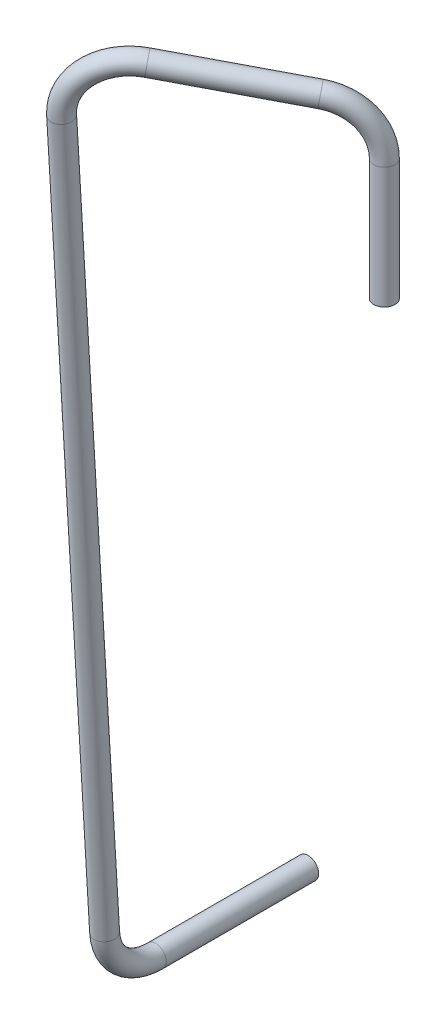
ISO-10303-21;
HEADER;
FILE_DESCRIPTION(('STEP AP214'),'2;1');
FILE_NAME('part.step','',(''),(''),'','','');
FILE_SCHEMA(('AUTOMOTIVE_DESIGN { 1 0 10303 214 1 1 1 1 }'));
ENDSEC;
DATA;
#1=APPLICATION_CONTEXT('core data for automotive mechanical design processes');
#2=APPLICATION_PROTOCOL_DEFINITION('international standard','automotive_design',2000,#1);
#3=PRODUCT_CONTEXT('',#1,'mechanical');
#4=PRODUCT('Part','Part','',(#3));
#5=PRODUCT_RELATED_PRODUCT_CATEGORY('part','',(#4));
#6=PRODUCT_DEFINITION_FORMATION('','',#4);
#7=PRODUCT_DEFINITION_CONTEXT('part definition',#1,'design');
#8=PRODUCT_DEFINITION('design','',#6,#7);
#9=PRODUCT_DEFINITION_SHAPE('','',#8);
#10=(LENGTH_UNIT() NAMED_UNIT(*) SI_UNIT(.MILLI.,.METRE.));
#11=(NAMED_UNIT(*) PLANE_ANGLE_UNIT() SI_UNIT($,.RADIAN.));
#12=(NAMED_UNIT(*) SI_UNIT($,.STERADIAN.) SOLID_ANGLE_UNIT());
#13=UNCERTAINTY_MEASURE_WITH_UNIT(LENGTH_MEASURE(1.E-05),#10,'distance_accuracy_value','');
#14=(GEOMETRIC_REPRESENTATION_CONTEXT(3) GLOBAL_UNCERTAINTY_ASSIGNED_CONTEXT((#13)) GLOBAL_UNIT_ASSIGNED_CONTEXT((#10,
#11,#12)) REPRESENTATION_CONTEXT('',''));
#15=CARTESIAN_POINT('',(0.,0.,0.));
#16=DIRECTION('',(0.,0.,1.));
#17=DIRECTION('',(1.,0.,0.));
#18=AXIS2_PLACEMENT_3D('',#15,#16,#17);
#19=CARTESIAN_POINT('',(0.,0.,0.));
#20=DIRECTION('',(0.,-1.,0.));
#21=DIRECTION('',(-0.353031889973649,0.,0.935611289297876));
#22=AXIS2_PLACEMENT_3D('',#19,#20,#21);
#23=PLANE('',#22);
#24=CARTESIAN_POINT('',(0.,0.,0.));
#25=DIRECTION('',(0.,-1.,0.));
#26=DIRECTION('',(0.,0.,-1.));
#27=AXIS2_PLACEMENT_3D('',#24,#25,#26);
#28=CIRCLE('',#27,0.585);
#29=CARTESIAN_POINT('',(0.,0.,-0.584999999999986));
#30=VERTEX_POINT('',#29);
#31=EDGE_CURVE('E78',#30,#30,#28,.T.);
#32=ORIENTED_EDGE('',*,*,#31,.F.);
#33=EDGE_LOOP('',(#32));
#34=FACE_BOUND('',#33,.T.);
#35=CARTESIAN_POINT('',(0.,0.,0.));
#36=DIRECTION('',(0.,-1.,0.));
#37=DIRECTION('',(-0.353031889973649,0.,0.935611289297876));
#38=AXIS2_PLACEMENT_3D('',#35,#36,#37);
#39=CIRCLE('',#38,1.585);
#40=CARTESIAN_POINT('',(-0.559555545608234,0.,1.48294389353715));
#41=VERTEX_POINT('',#40);
#42=EDGE_CURVE('E71',#41,#41,#39,.T.);
#43=ORIENTED_EDGE('',*,*,#42,.T.);
#44=EDGE_LOOP('',(#43));
#45=FACE_BOUND('',#44,.T.);
#46=ADVANCED_FACE('F43',(#34,#45),#23,.T.);
#47=CARTESIAN_POINT('',(-32.6331558464226,-100.644863340219,-21.2228280842737));
#48=DIRECTION('',(0.,0.,1.));
#49=DIRECTION('',(1.,0.,0.));
#50=AXIS2_PLACEMENT_3D('',#47,#48,#49);
#51=PLANE('',#50);
#52=CARTESIAN_POINT('',(-32.6331558464226,-100.644863340219,-21.2228280842737));
#53=DIRECTION('',(0.,0.,1.));
#54=DIRECTION('',(1.,0.,0.));
#55=AXIS2_PLACEMENT_3D('',#52,#53,#54);
#56=CIRCLE('',#55,0.585);
#57=CARTESIAN_POINT('',(-32.0481558464226,-100.644863340219,-21.2228280842737));
#58=VERTEX_POINT('',#57);
#59=EDGE_CURVE('E74',#58,#58,#56,.T.);
#60=ORIENTED_EDGE('',*,*,#59,.T.);
#61=EDGE_LOOP('',(#60));
#62=FACE_BOUND('',#61,.T.);
#63=CARTESIAN_POINT('',(-32.6331558464226,-100.644863340219,-21.2228280842737));
#64=DIRECTION('',(0.,0.,1.));
#65=DIRECTION('',(1.,0.,0.));
#66=AXIS2_PLACEMENT_3D('',#63,#64,#65);
#67=CIRCLE('',#66,1.585);
#68=CARTESIAN_POINT('',(-31.0481558464226,-100.644863340219,-21.2228280842737));
#69=VERTEX_POINT('',#68);
#70=EDGE_CURVE('E11',#69,#69,#67,.T.);
#71=ORIENTED_EDGE('',*,*,#70,.F.);
#72=EDGE_LOOP('',(#71));
#73=FACE_BOUND('',#72,.T.);
#74=ADVANCED_FACE('F110',(#62,#73),#51,.F.);
#75=CARTESIAN_POINT('',(0.,0.,0.));
#76=DIRECTION('',(0.,1.,0.));
#77=DIRECTION('',(0.,0.,1.));
#78=AXIS2_PLACEMENT_3D('',#75,#76,#77);
#79=CYLINDRICAL_SURFACE('',#78,1.585);
#80=CARTESIAN_POINT('',(0.,18.1274107446735,0.));
#81=DIRECTION('',(0.,-1.,0.));
#82=DIRECTION('',(-0.353031889973649,0.,0.935611289297876));
#83=AXIS2_PLACEMENT_3D('',#80,#81,#82);
#84=CIRCLE('',#83,1.585);
#85=CARTESIAN_POINT('',(1.22333144320822,18.1274107446735,-1.00781207576515));
#86=VERTEX_POINT('',#85);
#87=EDGE_CURVE('E68',#86,#86,#84,.T.);
#88=ORIENTED_EDGE('',*,*,#87,.T.);
#89=EDGE_LOOP('',(#88));
#90=FACE_BOUND('',#89,.T.);
#91=ORIENTED_EDGE('',*,*,#42,.F.);
#92=EDGE_LOOP('',(#91));
#93=FACE_BOUND('',#92,.T.);
#94=ADVANCED_FACE('F114',(#90,#93),#79,.T.);
#95=CARTESIAN_POINT('',(-6.17454356193424,18.1274107446735,5.08674864739516));
#96=DIRECTION('',(0.635843580924393,0.,0.771817945241781));
#97=DIRECTION('',(0.771817945241781,0.,-0.635843580924393));
#98=AXIS2_PLACEMENT_3D('',#95,#96,#97);
#99=TOROIDAL_SURFACE('',#98,7.99999999999999,1.585);
#100=CARTESIAN_POINT('',(-5.24377441217663,26.0359946437579,4.31995695403743));
#101=DIRECTION('',(0.762998371845444,-0.150742988598504,-0.628577788304354));
#102=DIRECTION('',(0.215510441859593,-0.857467232198858,0.467231414991237));
#103=AXIS2_PLACEMENT_3D('',#100,#101,#102);
#104=CIRCLE('',#103,1.585);
#105=CARTESIAN_POINT('',(-5.0593657743809,27.602882828764,4.16803634979092));
#106=VERTEX_POINT('',#105);
#107=EDGE_CURVE('E65',#106,#106,#104,.T.);
#108=CARTESIAN_POINT('',(-6.17454356193424,18.1274107446735,5.08674864739516));
#109=DIRECTION('',(0.635843580924393,0.,0.771817945241781));
#110=DIRECTION('',(0.771817945241781,0.,-0.635843580924393));
#111=AXIS2_PLACEMENT_3D('',#108,#109,#110);
#112=CIRCLE('',#111,9.58499999999999);
#113=EDGE_CURVE('',#86,#106,#112,.T.);
#114=ORIENTED_EDGE('',*,*,#87,.F.);
#115=ORIENTED_EDGE('',*,*,#107,.T.);
#116=ORIENTED_EDGE('',*,*,#113,.T.);
#117=ORIENTED_EDGE('',*,*,#113,.F.);
#118=EDGE_LOOP('',(#114,#116,#115,#117));
#119=FACE_BOUND('',#118,.T.);
#120=ADVANCED_FACE('F116',(#119),#99,.T.);
#121=CARTESIAN_POINT('',(-5.24377441217663,26.0359946437579,4.31995695403742));
#122=DIRECTION('',(-0.762998371845444,0.150742988598504,0.628577788304353));
#123=DIRECTION('',(0.635843580924393,0.,0.771817945241781));
#124=AXIS2_PLACEMENT_3D('',#121,#122,#123);
#125=CYLINDRICAL_SURFACE('',#124,1.585);
#126=CARTESIAN_POINT('',(-19.4494282729454,28.842557274801,16.0229419337065));
#127=DIRECTION('',(0.762998371845444,-0.150742988598504,-0.628577788304354));
#128=DIRECTION('',(0.215510441859593,-0.857467232198858,0.467231414991237));
#129=AXIS2_PLACEMENT_3D('',#126,#127,#128);
#130=CIRCLE('',#129,1.585);
#131=CARTESIAN_POINT('',(-19.1575864485751,30.4003376663296,16.0036131645481));
#132=VERTEX_POINT('',#131);
#133=EDGE_CURVE('E62',#132,#132,#130,.T.);
#134=ORIENTED_EDGE('',*,*,#133,.T.);
#135=EDGE_LOOP('',(#134));
#136=FACE_BOUND('',#135,.T.);
#137=ORIENTED_EDGE('',*,*,#107,.F.);
#138=EDGE_LOOP('',(#137));
#139=FACE_BOUND('',#138,.T.);
#140=ADVANCED_FACE('F123',(#136,#139),#125,.T.);
#141=CARTESIAN_POINT('',(-20.9224469448459,20.9799433112496,16.1205003900265));
#142=DIRECTION('',(0.619621343596096,-0.106433734447794,0.777651111187829));
#143=DIRECTION('',(0.782093560801873,0.,-0.623161024256369));
#144=AXIS2_PLACEMENT_3D('',#141,#142,#143);
#145=TOROIDAL_SURFACE('',#144,8.,1.585);
#146=CARTESIAN_POINT('',(-27.1915310645815,20.7587380022402,21.0853420300937));
#147=DIRECTION('',(0.0445507602928074,0.993935259950329,0.100538195651227));
#148=DIRECTION('',(0.998196545789588,-0.0402353790968736,-0.0445507602928071));
#149=AXIS2_PLACEMENT_3D('',#146,#147,#148);
#150=CIRCLE('',#149,1.585);
#151=CARTESIAN_POINT('',(-28.4335933558041,20.7149117003927,22.0690012800321));
#152=VERTEX_POINT('',#151);
#153=EDGE_CURVE('E57',#152,#152,#150,.T.);
#154=CARTESIAN_POINT('',(-20.9224469448459,20.9799433112496,16.1205003900265));
#155=DIRECTION('',(0.619621343596096,-0.106433734447794,0.777651111187829));
#156=DIRECTION('',(0.782093560801873,0.,-0.623161024256369));
#157=AXIS2_PLACEMENT_3D('',#154,#155,#156);
#158=CIRCLE('',#157,9.585);
#159=EDGE_CURVE('',#132,#152,#158,.T.);
#160=ORIENTED_EDGE('',*,*,#133,.F.);
#161=ORIENTED_EDGE('',*,*,#153,.T.);
#162=ORIENTED_EDGE('',*,*,#159,.T.);
#163=ORIENTED_EDGE('',*,*,#159,.F.);
#164=EDGE_LOOP('',(#160,#162,#161,#163));
#165=FACE_BOUND('',#164,.T.);
#166=ADVANCED_FACE('F140',(#165),#145,.T.);
#167=CARTESIAN_POINT('',(-27.1915310645815,20.7587380022402,21.0853420300937));
#168=DIRECTION('',(-0.0445507602928078,-0.993935259950329,-0.100538195651228));
#169=DIRECTION('',(0.,0.100638117026072,-0.994923097229855));
#170=AXIS2_PLACEMENT_3D('',#167,#168,#169);
#171=CYLINDRICAL_SURFACE('',#170,1.585);
#172=CARTESIAN_POINT('',(-32.3109496338784,-93.4563863418921,9.53229327497306));
#173=DIRECTION('',(0.0445507602928078,0.993935259950329,0.100538195651228));
#174=DIRECTION('',(0.998196545789588,-0.0402353790968739,-0.0445507602928071));
#175=AXIS2_PLACEMENT_3D('',#172,#173,#174);
#176=CIRCLE('',#175,1.585);
#177=CARTESIAN_POINT('',(-32.3180850868879,-93.6155795474687,11.1092623959797));
#178=VERTEX_POINT('',#177);
#179=EDGE_CURVE('E53',#178,#178,#176,.T.);
#180=ORIENTED_EDGE('',*,*,#179,.T.);
#181=EDGE_LOOP('',(#180));
#182=FACE_BOUND('',#181,.T.);
#183=ORIENTED_EDGE('',*,*,#153,.F.);
#184=EDGE_LOOP('',(#183));
#185=FACE_BOUND('',#184,.T.);
#186=ADVANCED_FACE('F134',(#182,#185),#171,.T.);
#187=CARTESIAN_POINT('',(-32.2749347290984,-92.6528875124834,1.57282767998666));
#188=DIRECTION('',(0.998996978466894,-0.0447776396655265,0.));
#189=DIRECTION('',(0.0447776396655265,0.998996978466894,0.));
#190=AXIS2_PLACEMENT_3D('',#187,#188,#189);
#191=TOROIDAL_SURFACE('',#190,7.99999999999998,1.585);
#192=CARTESIAN_POINT('',(-32.6331558464226,-100.644863340219,1.57282767998665));
#193=DIRECTION('',(0.,0.,1.));
#194=DIRECTION('',(1.,0.,0.));
#195=AXIS2_PLACEMENT_3D('',#192,#193,#194);
#196=CIRCLE('',#195,1.585);
#197=CARTESIAN_POINT('',(-32.7041284052924,-102.228273551089,1.57282767998664));
#198=VERTEX_POINT('',#197);
#199=EDGE_CURVE('E49',#198,#198,#196,.T.);
#200=CARTESIAN_POINT('',(-32.2749347290984,-92.6528875124834,1.57282767998666));
#201=DIRECTION('',(0.998996978466894,-0.0447776396655265,0.));
#202=DIRECTION('',(0.0447776396655265,0.998996978466894,0.));
#203=AXIS2_PLACEMENT_3D('',#200,#201,#202);
#204=CIRCLE('',#203,9.58499999999998);
#205=EDGE_CURVE('',#178,#198,#204,.T.);
#206=ORIENTED_EDGE('',*,*,#179,.F.);
#207=ORIENTED_EDGE('',*,*,#199,.T.);
#208=ORIENTED_EDGE('',*,*,#205,.T.);
#209=ORIENTED_EDGE('',*,*,#205,.F.);
#210=EDGE_LOOP('',(#206,#208,#207,#209));
#211=FACE_BOUND('',#210,.T.);
#212=ADVANCED_FACE('F129',(#211),#191,.T.);
#213=CARTESIAN_POINT('',(-32.6331558464226,-100.644863340219,1.57282767998666));
#214=DIRECTION('',(0.,0.,-1.));
#215=DIRECTION('',(-1.,0.,0.));
#216=AXIS2_PLACEMENT_3D('',#213,#214,#215);
#217=CYLINDRICAL_SURFACE('',#216,1.585);
#218=ORIENTED_EDGE('',*,*,#70,.T.);
#219=EDGE_LOOP('',(#218));
#220=FACE_BOUND('',#219,.T.);
#221=ORIENTED_EDGE('',*,*,#199,.F.);
#222=EDGE_LOOP('',(#221));
#223=FACE_BOUND('',#222,.T.);
#224=ADVANCED_FACE('F104',(#220,#223),#217,.T.);
#225=CARTESIAN_POINT('',(0.,0.,0.));
#226=DIRECTION('',(0.,1.,0.));
#227=DIRECTION('',(0.,0.,1.));
#228=AXIS2_PLACEMENT_3D('',#225,#226,#227);
#229=CYLINDRICAL_SURFACE('',#228,0.585);
#230=CARTESIAN_POINT('',(0.,18.1274107446735,0.));
#231=DIRECTION('',(0.,1.,0.));
#232=DIRECTION('',(0.,0.,1.));
#233=AXIS2_PLACEMENT_3D('',#230,#231,#232);
#234=CIRCLE('',#233,0.585);
#235=CARTESIAN_POINT('',(0.451513497966443,18.1274107446735,-0.371968494840757));
#236=VERTEX_POINT('',#235);
#237=EDGE_CURVE('E81',#236,#236,#234,.F.);
#238=ORIENTED_EDGE('',*,*,#237,.F.);
#239=EDGE_LOOP('',(#238));
#240=FACE_BOUND('',#239,.T.);
#241=ORIENTED_EDGE('',*,*,#31,.T.);
#242=EDGE_LOOP('',(#241));
#243=FACE_BOUND('',#242,.T.);
#244=ADVANCED_FACE('F101',(#240,#243),#229,.F.);
#245=CARTESIAN_POINT('',(-6.17454356193424,18.1274107446735,5.08674864739516));
#246=DIRECTION('',(0.635843580924393,0.,0.771817945241781));
#247=DIRECTION('',(0.771817945241781,0.,-0.635843580924393));
#248=AXIS2_PLACEMENT_3D('',#245,#246,#247);
#249=TOROIDAL_SURFACE('',#248,7.99999999999999,0.585);
#250=CARTESIAN_POINT('',(-5.24377441217663,26.0359946437579,4.31995695403742));
#251=DIRECTION('',(0.762998371845444,-0.150742988598503,-0.628577788304354));
#252=DIRECTION('',(-0.635843580924393,0.,-0.771817945241781));
#253=AXIS2_PLACEMENT_3D('',#250,#251,#252);
#254=CIRCLE('',#253,0.585);
#255=CARTESIAN_POINT('',(-5.1757119181006,26.6143098413784,4.26388531146063));
#256=VERTEX_POINT('',#255);
#257=EDGE_CURVE('E93',#256,#256,#254,.T.);
#258=CARTESIAN_POINT('',(-6.17454356193424,18.1274107446735,5.08674864739516));
#259=DIRECTION('',(0.635843580924393,0.,0.771817945241781));
#260=DIRECTION('',(0.771817945241781,0.,-0.635843580924393));
#261=AXIS2_PLACEMENT_3D('',#258,#259,#260);
#262=CIRCLE('',#261,8.58499999999999);
#263=EDGE_CURVE('',#236,#256,#262,.T.);
#264=ORIENTED_EDGE('',*,*,#237,.T.);
#265=ORIENTED_EDGE('',*,*,#257,.F.);
#266=ORIENTED_EDGE('',*,*,#263,.T.);
#267=ORIENTED_EDGE('',*,*,#263,.F.);
#268=EDGE_LOOP('',(#264,#266,#265,#267));
#269=FACE_BOUND('',#268,.T.);
#270=ADVANCED_FACE('F99',(#269),#249,.F.);
#271=CARTESIAN_POINT('',(-5.24377441217663,26.0359946437579,4.31995695403742));
#272=DIRECTION('',(-0.762998371845444,0.150742988598504,0.628577788304353));
#273=DIRECTION('',(0.635843580924393,0.,0.771817945241781));
#274=AXIS2_PLACEMENT_3D('',#271,#272,#273);
#275=CYLINDRICAL_SURFACE('',#274,0.585);
#276=CARTESIAN_POINT('',(-19.4494282729454,28.842557274801,16.0229419337065));
#277=DIRECTION('',(-0.762998371845444,0.150742988598504,0.628577788304353));
#278=DIRECTION('',(0.635843580924393,0.,0.771817945241781));
#279=AXIS2_PLACEMENT_3D('',#276,#277,#278);
#280=CIRCLE('',#279,0.585);
#281=CARTESIAN_POINT('',(-19.3417137825626,29.4175109208857,16.0158079715881));
#282=VERTEX_POINT('',#281);
#283=EDGE_CURVE('E90',#282,#282,#280,.F.);
#284=ORIENTED_EDGE('',*,*,#283,.F.);
#285=EDGE_LOOP('',(#284));
#286=FACE_BOUND('',#285,.T.);
#287=ORIENTED_EDGE('',*,*,#257,.T.);
#288=EDGE_LOOP('',(#287));
#289=FACE_BOUND('',#288,.T.);
#290=ADVANCED_FACE('F188',(#286,#289),#275,.F.);
#291=CARTESIAN_POINT('',(-20.9224469448459,20.9799433112496,16.1205003900265));
#292=DIRECTION('',(0.619621343596096,-0.106433734447794,0.777651111187829));
#293=DIRECTION('',(0.782093560801873,0.,-0.623161024256369));
#294=AXIS2_PLACEMENT_3D('',#291,#292,#293);
#295=TOROIDAL_SURFACE('',#294,8.,0.585);
#296=CARTESIAN_POINT('',(-27.1915310645815,20.7587380022402,21.0853420300937));
#297=DIRECTION('',(0.0445507602928077,0.993935259950329,0.100538195651226));
#298=DIRECTION('',(0.,-0.100638117026071,0.994923097229855));
#299=AXIS2_PLACEMENT_3D('',#296,#297,#298);
#300=CIRCLE('',#299,0.585);
#301=CARTESIAN_POINT('',(-27.6499578408371,20.7425623640189,21.4483960750237));
#302=VERTEX_POINT('',#301);
#303=EDGE_CURVE('E87',#302,#302,#300,.T.);
#304=CARTESIAN_POINT('',(-20.9224469448459,20.9799433112496,16.1205003900265));
#305=DIRECTION('',(0.619621343596096,-0.106433734447794,0.777651111187829));
#306=DIRECTION('',(0.782093560801873,0.,-0.623161024256369));
#307=AXIS2_PLACEMENT_3D('',#304,#305,#306);
#308=CIRCLE('',#307,8.585);
#309=EDGE_CURVE('',#282,#302,#308,.T.);
#310=ORIENTED_EDGE('',*,*,#283,.T.);
#311=ORIENTED_EDGE('',*,*,#303,.F.);
#312=ORIENTED_EDGE('',*,*,#309,.T.);
#313=ORIENTED_EDGE('',*,*,#309,.F.);
#314=EDGE_LOOP('',(#310,#312,#311,#313));
#315=FACE_BOUND('',#314,.T.);
#316=ADVANCED_FACE('F198',(#315),#295,.F.);
#317=CARTESIAN_POINT('',(-27.1915310645815,20.7587380022402,21.0853420300937));
#318=DIRECTION('',(-0.0445507602928078,-0.993935259950329,-0.100538195651228));
#319=DIRECTION('',(0.,0.100638117026072,-0.994923097229855));
#320=AXIS2_PLACEMENT_3D('',#317,#318,#319);
#321=CYLINDRICAL_SURFACE('',#320,0.585);
#322=CARTESIAN_POINT('',(-32.3109496338784,-93.4563863418921,9.53229327497306));
#323=DIRECTION('',(-0.0445507602928078,-0.993935259950329,-0.100538195651228));
#324=DIRECTION('',(0.,0.100638117026072,-0.994923097229855));
#325=AXIS2_PLACEMENT_3D('',#322,#323,#324);
#326=CIRCLE('',#325,0.585);
#327=CARTESIAN_POINT('',(-32.3135832237904,-93.5151421937926,10.1143291966064));
#328=VERTEX_POINT('',#327);
#329=EDGE_CURVE('E84',#328,#328,#326,.F.);
#330=ORIENTED_EDGE('',*,*,#329,.F.);
#331=EDGE_LOOP('',(#330));
#332=FACE_BOUND('',#331,.T.);
#333=ORIENTED_EDGE('',*,*,#303,.T.);
#334=EDGE_LOOP('',(#333));
#335=FACE_BOUND('',#334,.T.);
#336=ADVANCED_FACE('F208',(#332,#335),#321,.F.);
#337=CARTESIAN_POINT('',(-32.2749347290984,-92.6528875124834,1.57282767998666));
#338=DIRECTION('',(0.998996978466894,-0.0447776396655265,0.));
#339=DIRECTION('',(0.0447776396655265,0.998996978466894,0.));
#340=AXIS2_PLACEMENT_3D('',#337,#338,#339);
#341=TOROIDAL_SURFACE('',#340,7.99999999999998,0.585);
#342=CARTESIAN_POINT('',(-32.6331558464226,-100.644863340219,1.57282767998665));
#343=DIRECTION('',(0.,0.,1.));
#344=DIRECTION('',(0.,-1.,0.));
#345=AXIS2_PLACEMENT_3D('',#342,#343,#344);
#346=CIRCLE('',#345,0.585);
#347=CARTESIAN_POINT('',(-32.6593507656269,-101.229276572622,1.57282767998665));
#348=VERTEX_POINT('',#347);
#349=EDGE_CURVE('E77',#348,#348,#346,.T.);
#350=CARTESIAN_POINT('',(-32.2749347290984,-92.6528875124834,1.57282767998666));
#351=DIRECTION('',(0.998996978466894,-0.0447776396655265,0.));
#352=DIRECTION('',(0.0447776396655265,0.998996978466894,0.));
#353=AXIS2_PLACEMENT_3D('',#350,#351,#352);
#354=CIRCLE('',#353,8.58499999999998);
#355=EDGE_CURVE('',#328,#348,#354,.T.);
#356=ORIENTED_EDGE('',*,*,#329,.T.);
#357=ORIENTED_EDGE('',*,*,#349,.F.);
#358=ORIENTED_EDGE('',*,*,#355,.T.);
#359=ORIENTED_EDGE('',*,*,#355,.F.);
#360=EDGE_LOOP('',(#356,#358,#357,#359));
#361=FACE_BOUND('',#360,.T.);
#362=ADVANCED_FACE('F218',(#361),#341,.F.);
#363=CARTESIAN_POINT('',(-32.6331558464226,-100.644863340219,1.57282767998666));
#364=DIRECTION('',(0.,0.,-1.));
#365=DIRECTION('',(-1.,0.,0.));
#366=AXIS2_PLACEMENT_3D('',#363,#364,#365);
#367=CYLINDRICAL_SURFACE('',#366,0.585);
#368=ORIENTED_EDGE('',*,*,#59,.F.);
#369=EDGE_LOOP('',(#368));
#370=FACE_BOUND('',#369,.T.);
#371=ORIENTED_EDGE('',*,*,#349,.T.);
#372=EDGE_LOOP('',(#371));
#373=FACE_BOUND('',#372,.T.);
#374=ADVANCED_FACE('F111',(#370,#373),#367,.F.);
#375=CLOSED_SHELL('',(#46,#74,#94,#120,#140,#166,#186,#212,#224,#244,#270,#290,#316,#336,#362,#374));
#376=MANIFOLD_SOLID_BREP('B2',#375);
#377=ADVANCED_BREP_SHAPE_REPRESENTATION('',(#18,#376),#14);
#378=SHAPE_DEFINITION_REPRESENTATION(#9,#377);
ENDSEC;
END-ISO-10303-21;
